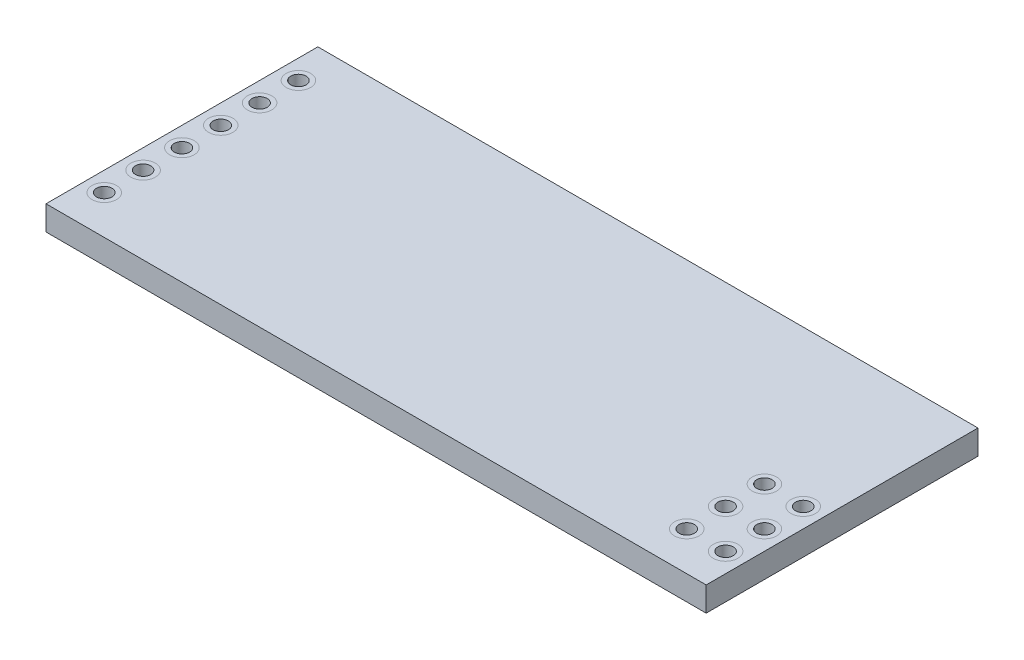
ISO-10303-21;
HEADER;
FILE_DESCRIPTION(('STEP AP214'),'2;1');
FILE_NAME('part.step','',(''),(''),'','','');
FILE_SCHEMA(('AUTOMOTIVE_DESIGN { 1 0 10303 214 1 1 1 1 }'));
ENDSEC;
DATA;
#1=APPLICATION_CONTEXT('core data for automotive mechanical design processes');
#2=APPLICATION_PROTOCOL_DEFINITION('international standard','automotive_design',2000,#1);
#3=PRODUCT_CONTEXT('',#1,'mechanical');
#4=PRODUCT('Part','Part','',(#3));
#5=PRODUCT_RELATED_PRODUCT_CATEGORY('part','',(#4));
#6=PRODUCT_DEFINITION_FORMATION('','',#4);
#7=PRODUCT_DEFINITION_CONTEXT('part definition',#1,'design');
#8=PRODUCT_DEFINITION('design','',#6,#7);
#9=PRODUCT_DEFINITION_SHAPE('','',#8);
#10=(LENGTH_UNIT() NAMED_UNIT(*) SI_UNIT(.MILLI.,.METRE.));
#11=(NAMED_UNIT(*) PLANE_ANGLE_UNIT() SI_UNIT($,.RADIAN.));
#12=(NAMED_UNIT(*) SI_UNIT($,.STERADIAN.) SOLID_ANGLE_UNIT());
#13=UNCERTAINTY_MEASURE_WITH_UNIT(LENGTH_MEASURE(1.E-05),#10,'distance_accuracy_value','');
#14=(GEOMETRIC_REPRESENTATION_CONTEXT(3) GLOBAL_UNCERTAINTY_ASSIGNED_CONTEXT((#13)) GLOBAL_UNIT_ASSIGNED_CONTEXT((#10,
#11,#12)) REPRESENTATION_CONTEXT('',''));
#15=CARTESIAN_POINT('',(0.,0.,0.));
#16=DIRECTION('',(0.,0.,1.));
#17=DIRECTION('',(1.,0.,0.));
#18=AXIS2_PLACEMENT_3D('',#15,#16,#17);
#19=CARTESIAN_POINT('',(0.,1.6,0.));
#20=DIRECTION('',(0.,1.,0.));
#21=DIRECTION('',(0.,0.,1.));
#22=AXIS2_PLACEMENT_3D('',#19,#20,#21);
#23=PLANE('',#22);
#24=CARTESIAN_POINT('',(20.32,1.6,6.35000000000001));
#25=DIRECTION('',(0.,1.,0.));
#26=DIRECTION('',(0.,0.,1.));
#27=AXIS2_PLACEMENT_3D('',#24,#25,#26);
#28=CIRCLE('',#27,0.80000000000055);
#29=CARTESIAN_POINT('',(20.32,1.6,7.15000000000056));
#30=VERTEX_POINT('',#29);
#31=EDGE_CURVE('E147',#30,#30,#28,.F.);
#32=ORIENTED_EDGE('',*,*,#31,.T.);
#33=EDGE_LOOP('',(#32));
#34=FACE_BOUND('',#33,.T.);
#35=CARTESIAN_POINT('',(17.78,1.6,6.35000000000003));
#36=DIRECTION('',(0.,1.,0.));
#37=DIRECTION('',(0.,0.,1.));
#38=AXIS2_PLACEMENT_3D('',#35,#36,#37);
#39=CIRCLE('',#38,0.800000000000557);
#40=CARTESIAN_POINT('',(17.78,1.6,7.15000000000058));
#41=VERTEX_POINT('',#40);
#42=EDGE_CURVE('E144',#41,#41,#39,.F.);
#43=ORIENTED_EDGE('',*,*,#42,.T.);
#44=EDGE_LOOP('',(#43));
#45=FACE_BOUND('',#44,.T.);
#46=CARTESIAN_POINT('',(20.32,1.6,3.81000000000001));
#47=DIRECTION('',(0.,1.,0.));
#48=DIRECTION('',(0.,0.,1.));
#49=AXIS2_PLACEMENT_3D('',#46,#47,#48);
#50=CIRCLE('',#49,0.80000000000055);
#51=CARTESIAN_POINT('',(20.32,1.6,4.61000000000056));
#52=VERTEX_POINT('',#51);
#53=EDGE_CURVE('E141',#52,#52,#50,.F.);
#54=ORIENTED_EDGE('',*,*,#53,.T.);
#55=EDGE_LOOP('',(#54));
#56=FACE_BOUND('',#55,.T.);
#57=CARTESIAN_POINT('',(17.78,1.6,3.81000000000003));
#58=DIRECTION('',(0.,1.,0.));
#59=DIRECTION('',(0.,0.,1.));
#60=AXIS2_PLACEMENT_3D('',#57,#58,#59);
#61=CIRCLE('',#60,0.800000000000557);
#62=CARTESIAN_POINT('',(17.78,1.6,4.61000000000058));
#63=VERTEX_POINT('',#62);
#64=EDGE_CURVE('E138',#63,#63,#61,.F.);
#65=ORIENTED_EDGE('',*,*,#64,.T.);
#66=EDGE_LOOP('',(#65));
#67=FACE_BOUND('',#66,.T.);
#68=CARTESIAN_POINT('',(20.32,1.6,1.27000000000001));
#69=DIRECTION('',(0.,1.,0.));
#70=DIRECTION('',(0.,0.,1.));
#71=AXIS2_PLACEMENT_3D('',#68,#69,#70);
#72=CIRCLE('',#71,0.80000000000055);
#73=CARTESIAN_POINT('',(20.32,1.6,2.07000000000056));
#74=VERTEX_POINT('',#73);
#75=EDGE_CURVE('E135',#74,#74,#72,.F.);
#76=ORIENTED_EDGE('',*,*,#75,.T.);
#77=EDGE_LOOP('',(#76));
#78=FACE_BOUND('',#77,.T.);
#79=CARTESIAN_POINT('',(17.78,1.6,1.27000000000003));
#80=DIRECTION('',(0.,1.,0.));
#81=DIRECTION('',(0.,0.,1.));
#82=AXIS2_PLACEMENT_3D('',#79,#80,#81);
#83=CIRCLE('',#82,0.800000000000557);
#84=CARTESIAN_POINT('',(17.78,1.6,2.07000000000058));
#85=VERTEX_POINT('',#84);
#86=EDGE_CURVE('E132',#85,#85,#83,.F.);
#87=ORIENTED_EDGE('',*,*,#86,.T.);
#88=EDGE_LOOP('',(#87));
#89=FACE_BOUND('',#88,.T.);
#90=CARTESIAN_POINT('',(-20.32,1.6,6.35000000000001));
#91=DIRECTION('',(0.,1.,0.));
#92=DIRECTION('',(0.,0.,1.));
#93=AXIS2_PLACEMENT_3D('',#90,#91,#92);
#94=CIRCLE('',#93,0.800000000000551);
#95=CARTESIAN_POINT('',(-20.32,1.6,7.15000000000056));
#96=VERTEX_POINT('',#95);
#97=EDGE_CURVE('E129',#96,#96,#94,.F.);
#98=ORIENTED_EDGE('',*,*,#97,.T.);
#99=EDGE_LOOP('',(#98));
#100=FACE_BOUND('',#99,.T.);
#101=CARTESIAN_POINT('',(-20.32,1.6,3.81000000000001));
#102=DIRECTION('',(0.,1.,0.));
#103=DIRECTION('',(0.,0.,1.));
#104=AXIS2_PLACEMENT_3D('',#101,#102,#103);
#105=CIRCLE('',#104,0.80000000000055);
#106=CARTESIAN_POINT('',(-20.32,1.6,4.61000000000056));
#107=VERTEX_POINT('',#106);
#108=EDGE_CURVE('E126',#107,#107,#105,.F.);
#109=ORIENTED_EDGE('',*,*,#108,.T.);
#110=EDGE_LOOP('',(#109));
#111=FACE_BOUND('',#110,.T.);
#112=CARTESIAN_POINT('',(-20.32,1.6,1.27000000000001));
#113=DIRECTION('',(0.,1.,0.));
#114=DIRECTION('',(0.,0.,1.));
#115=AXIS2_PLACEMENT_3D('',#112,#113,#114);
#116=CIRCLE('',#115,0.80000000000055);
#117=CARTESIAN_POINT('',(-20.32,1.6,2.07000000000056));
#118=VERTEX_POINT('',#117);
#119=EDGE_CURVE('E123',#118,#118,#116,.F.);
#120=ORIENTED_EDGE('',*,*,#119,.T.);
#121=EDGE_LOOP('',(#120));
#122=FACE_BOUND('',#121,.T.);
#123=CARTESIAN_POINT('',(-20.32,1.6,-1.26999999999999));
#124=DIRECTION('',(0.,1.,0.));
#125=DIRECTION('',(0.,0.,1.));
#126=AXIS2_PLACEMENT_3D('',#123,#124,#125);
#127=CIRCLE('',#126,0.80000000000055);
#128=CARTESIAN_POINT('',(-20.32,1.6,-0.46999999999944));
#129=VERTEX_POINT('',#128);
#130=EDGE_CURVE('E120',#129,#129,#127,.F.);
#131=ORIENTED_EDGE('',*,*,#130,.T.);
#132=EDGE_LOOP('',(#131));
#133=FACE_BOUND('',#132,.T.);
#134=CARTESIAN_POINT('',(-20.32,1.6,-3.80999999999999));
#135=DIRECTION('',(0.,1.,0.));
#136=DIRECTION('',(0.,0.,1.));
#137=AXIS2_PLACEMENT_3D('',#134,#135,#136);
#138=CIRCLE('',#137,0.800000000000558);
#139=CARTESIAN_POINT('',(-20.32,1.6,-3.00999999999943));
#140=VERTEX_POINT('',#139);
#141=EDGE_CURVE('E117',#140,#140,#138,.F.);
#142=ORIENTED_EDGE('',*,*,#141,.T.);
#143=EDGE_LOOP('',(#142));
#144=FACE_BOUND('',#143,.T.);
#145=CARTESIAN_POINT('',(-20.32,1.6,-6.34999999999999));
#146=DIRECTION('',(0.,1.,0.));
#147=DIRECTION('',(0.,0.,1.));
#148=AXIS2_PLACEMENT_3D('',#145,#146,#147);
#149=CIRCLE('',#148,0.800000000000558);
#150=CARTESIAN_POINT('',(-20.32,1.6,-5.54999999999943));
#151=VERTEX_POINT('',#150);
#152=EDGE_CURVE('E114',#151,#151,#149,.F.);
#153=ORIENTED_EDGE('',*,*,#152,.T.);
#154=EDGE_LOOP('',(#153));
#155=FACE_BOUND('',#154,.T.);
#156=DIRECTION('',(0.,0.,-1.));
#157=VECTOR('',#156,1.);
#158=CARTESIAN_POINT('',(21.59,1.6,-8.89));
#159=LINE('',#158,#157);
#160=CARTESIAN_POINT('',(21.59,1.6,8.89));
#161=VERTEX_POINT('',#160);
#162=CARTESIAN_POINT('',(21.59,1.6,-8.89));
#163=VERTEX_POINT('',#162);
#164=EDGE_CURVE('E87',#161,#163,#159,.T.);
#165=ORIENTED_EDGE('',*,*,#164,.T.);
#166=DIRECTION('',(-1.,0.,0.));
#167=VECTOR('',#166,1.);
#168=CARTESIAN_POINT('',(-21.59,1.6,-8.89));
#169=LINE('',#168,#167);
#170=CARTESIAN_POINT('',(-21.59,1.6,-8.89));
#171=VERTEX_POINT('',#170);
#172=EDGE_CURVE('E83',#163,#171,#169,.T.);
#173=ORIENTED_EDGE('',*,*,#172,.T.);
#174=DIRECTION('',(0.,0.,1.));
#175=VECTOR('',#174,1.);
#176=CARTESIAN_POINT('',(-21.59,1.6,-8.89));
#177=LINE('',#176,#175);
#178=CARTESIAN_POINT('',(-21.59,1.6,8.89));
#179=VERTEX_POINT('',#178);
#180=EDGE_CURVE('E85',#171,#179,#177,.T.);
#181=ORIENTED_EDGE('',*,*,#180,.T.);
#182=DIRECTION('',(1.,0.,0.));
#183=VECTOR('',#182,1.);
#184=CARTESIAN_POINT('',(-21.59,1.6,8.89));
#185=LINE('',#184,#183);
#186=EDGE_CURVE('E52',#179,#161,#185,.T.);
#187=ORIENTED_EDGE('',*,*,#186,.T.);
#188=EDGE_LOOP('',(#165,#173,#181,#187));
#189=FACE_BOUND('',#188,.T.);
#190=ADVANCED_FACE('F35',(#34,#45,#56,#67,#78,#89,#100,#111,#122,#133,#144,#155,#189),#23,.T.);
#191=CARTESIAN_POINT('',(0.,0.,0.));
#192=DIRECTION('',(0.,1.,0.));
#193=DIRECTION('',(0.,0.,1.));
#194=AXIS2_PLACEMENT_3D('',#191,#192,#193);
#195=PLANE('',#194);
#196=CARTESIAN_POINT('',(20.32,0.,1.27000000000001));
#197=DIRECTION('',(0.,1.,0.));
#198=DIRECTION('',(0.,0.,1.));
#199=AXIS2_PLACEMENT_3D('',#196,#197,#198);
#200=CIRCLE('',#199,0.800000000000592);
#201=CARTESIAN_POINT('',(20.32,0.,2.0700000000006));
#202=VERTEX_POINT('',#201);
#203=EDGE_CURVE('E216',#202,#202,#200,.T.);
#204=ORIENTED_EDGE('',*,*,#203,.T.);
#205=EDGE_LOOP('',(#204));
#206=FACE_BOUND('',#205,.T.);
#207=CARTESIAN_POINT('',(17.78,0.,1.27000000000003));
#208=DIRECTION('',(0.,1.,0.));
#209=DIRECTION('',(0.,0.,1.));
#210=AXIS2_PLACEMENT_3D('',#207,#208,#209);
#211=CIRCLE('',#210,0.800000000000599);
#212=CARTESIAN_POINT('',(17.78,0.,2.07000000000063));
#213=VERTEX_POINT('',#212);
#214=EDGE_CURVE('E213',#213,#213,#211,.T.);
#215=ORIENTED_EDGE('',*,*,#214,.T.);
#216=EDGE_LOOP('',(#215));
#217=FACE_BOUND('',#216,.T.);
#218=CARTESIAN_POINT('',(17.78,0.,3.81000000000003));
#219=DIRECTION('',(0.,1.,0.));
#220=DIRECTION('',(0.,0.,1.));
#221=AXIS2_PLACEMENT_3D('',#218,#219,#220);
#222=CIRCLE('',#221,0.800000000000599);
#223=CARTESIAN_POINT('',(17.78,0.,4.61000000000063));
#224=VERTEX_POINT('',#223);
#225=EDGE_CURVE('E210',#224,#224,#222,.T.);
#226=ORIENTED_EDGE('',*,*,#225,.T.);
#227=EDGE_LOOP('',(#226));
#228=FACE_BOUND('',#227,.T.);
#229=CARTESIAN_POINT('',(20.32,0.,3.81000000000001));
#230=DIRECTION('',(0.,1.,0.));
#231=DIRECTION('',(0.,0.,1.));
#232=AXIS2_PLACEMENT_3D('',#229,#230,#231);
#233=CIRCLE('',#232,0.800000000000591);
#234=CARTESIAN_POINT('',(20.32,0.,4.6100000000006));
#235=VERTEX_POINT('',#234);
#236=EDGE_CURVE('E207',#235,#235,#233,.T.);
#237=ORIENTED_EDGE('',*,*,#236,.T.);
#238=EDGE_LOOP('',(#237));
#239=FACE_BOUND('',#238,.T.);
#240=CARTESIAN_POINT('',(20.32,0.,6.35000000000001));
#241=DIRECTION('',(0.,1.,0.));
#242=DIRECTION('',(0.,0.,1.));
#243=AXIS2_PLACEMENT_3D('',#240,#241,#242);
#244=CIRCLE('',#243,0.800000000000592);
#245=CARTESIAN_POINT('',(20.32,0.,7.1500000000006));
#246=VERTEX_POINT('',#245);
#247=EDGE_CURVE('E204',#246,#246,#244,.T.);
#248=ORIENTED_EDGE('',*,*,#247,.T.);
#249=EDGE_LOOP('',(#248));
#250=FACE_BOUND('',#249,.T.);
#251=CARTESIAN_POINT('',(17.78,0.,6.35000000000003));
#252=DIRECTION('',(0.,1.,0.));
#253=DIRECTION('',(0.,0.,1.));
#254=AXIS2_PLACEMENT_3D('',#251,#252,#253);
#255=CIRCLE('',#254,0.800000000000599);
#256=CARTESIAN_POINT('',(17.78,0.,7.15000000000063));
#257=VERTEX_POINT('',#256);
#258=EDGE_CURVE('E201',#257,#257,#255,.T.);
#259=ORIENTED_EDGE('',*,*,#258,.T.);
#260=EDGE_LOOP('',(#259));
#261=FACE_BOUND('',#260,.T.);
#262=CARTESIAN_POINT('',(-20.32,0.,-6.34999999999999));
#263=DIRECTION('',(0.,1.,0.));
#264=DIRECTION('',(0.,0.,1.));
#265=AXIS2_PLACEMENT_3D('',#262,#263,#264);
#266=CIRCLE('',#265,0.8000000000006);
#267=CARTESIAN_POINT('',(-20.32,0.,-5.54999999999939));
#268=VERTEX_POINT('',#267);
#269=EDGE_CURVE('E198',#268,#268,#266,.T.);
#270=ORIENTED_EDGE('',*,*,#269,.T.);
#271=EDGE_LOOP('',(#270));
#272=FACE_BOUND('',#271,.T.);
#273=CARTESIAN_POINT('',(-20.32,0.,-3.80999999999999));
#274=DIRECTION('',(0.,1.,0.));
#275=DIRECTION('',(0.,0.,1.));
#276=AXIS2_PLACEMENT_3D('',#273,#274,#275);
#277=CIRCLE('',#276,0.800000000000599);
#278=CARTESIAN_POINT('',(-20.32,0.,-3.00999999999939));
#279=VERTEX_POINT('',#278);
#280=EDGE_CURVE('E195',#279,#279,#277,.T.);
#281=ORIENTED_EDGE('',*,*,#280,.T.);
#282=EDGE_LOOP('',(#281));
#283=FACE_BOUND('',#282,.T.);
#284=CARTESIAN_POINT('',(-20.32,0.,-1.26999999999999));
#285=DIRECTION('',(0.,1.,0.));
#286=DIRECTION('',(0.,0.,1.));
#287=AXIS2_PLACEMENT_3D('',#284,#285,#286);
#288=CIRCLE('',#287,0.800000000000592);
#289=CARTESIAN_POINT('',(-20.32,0.,-0.469999999999398));
#290=VERTEX_POINT('',#289);
#291=EDGE_CURVE('E192',#290,#290,#288,.T.);
#292=ORIENTED_EDGE('',*,*,#291,.T.);
#293=EDGE_LOOP('',(#292));
#294=FACE_BOUND('',#293,.T.);
#295=CARTESIAN_POINT('',(-20.32,0.,1.27000000000001));
#296=DIRECTION('',(0.,1.,0.));
#297=DIRECTION('',(0.,0.,1.));
#298=AXIS2_PLACEMENT_3D('',#295,#296,#297);
#299=CIRCLE('',#298,0.800000000000592);
#300=CARTESIAN_POINT('',(-20.32,0.,2.0700000000006));
#301=VERTEX_POINT('',#300);
#302=EDGE_CURVE('E189',#301,#301,#299,.T.);
#303=ORIENTED_EDGE('',*,*,#302,.T.);
#304=EDGE_LOOP('',(#303));
#305=FACE_BOUND('',#304,.T.);
#306=CARTESIAN_POINT('',(-20.32,0.,3.81000000000001));
#307=DIRECTION('',(0.,1.,0.));
#308=DIRECTION('',(0.,0.,1.));
#309=AXIS2_PLACEMENT_3D('',#306,#307,#308);
#310=CIRCLE('',#309,0.800000000000592);
#311=CARTESIAN_POINT('',(-20.32,0.,4.6100000000006));
#312=VERTEX_POINT('',#311);
#313=EDGE_CURVE('E186',#312,#312,#310,.T.);
#314=ORIENTED_EDGE('',*,*,#313,.T.);
#315=EDGE_LOOP('',(#314));
#316=FACE_BOUND('',#315,.T.);
#317=CARTESIAN_POINT('',(-20.32,0.,6.35000000000001));
#318=DIRECTION('',(0.,1.,0.));
#319=DIRECTION('',(0.,0.,1.));
#320=AXIS2_PLACEMENT_3D('',#317,#318,#319);
#321=CIRCLE('',#320,0.800000000000593);
#322=CARTESIAN_POINT('',(-20.32,0.,7.1500000000006));
#323=VERTEX_POINT('',#322);
#324=EDGE_CURVE('E183',#323,#323,#321,.T.);
#325=ORIENTED_EDGE('',*,*,#324,.T.);
#326=EDGE_LOOP('',(#325));
#327=FACE_BOUND('',#326,.T.);
#328=DIRECTION('',(0.,0.,-1.));
#329=VECTOR('',#328,1.);
#330=CARTESIAN_POINT('',(21.59,0.,-8.89));
#331=LINE('',#330,#329);
#332=CARTESIAN_POINT('',(21.59,0.,8.89));
#333=VERTEX_POINT('',#332);
#334=CARTESIAN_POINT('',(21.59,0.,-8.89));
#335=VERTEX_POINT('',#334);
#336=EDGE_CURVE('E102',#333,#335,#331,.T.);
#337=ORIENTED_EDGE('',*,*,#336,.F.);
#338=DIRECTION('',(1.,0.,0.));
#339=VECTOR('',#338,1.);
#340=CARTESIAN_POINT('',(-21.59,0.,8.89));
#341=LINE('',#340,#339);
#342=CARTESIAN_POINT('',(-21.59,0.,8.89));
#343=VERTEX_POINT('',#342);
#344=EDGE_CURVE('E75',#343,#333,#341,.T.);
#345=ORIENTED_EDGE('',*,*,#344,.F.);
#346=DIRECTION('',(0.,0.,1.));
#347=VECTOR('',#346,1.);
#348=CARTESIAN_POINT('',(-21.59,0.,-8.89));
#349=LINE('',#348,#347);
#350=CARTESIAN_POINT('',(-21.59,0.,-8.89));
#351=VERTEX_POINT('',#350);
#352=EDGE_CURVE('E69',#351,#343,#349,.T.);
#353=ORIENTED_EDGE('',*,*,#352,.F.);
#354=DIRECTION('',(-1.,0.,0.));
#355=VECTOR('',#354,1.);
#356=CARTESIAN_POINT('',(-21.59,0.,-8.89));
#357=LINE('',#356,#355);
#358=EDGE_CURVE('E92',#335,#351,#357,.T.);
#359=ORIENTED_EDGE('',*,*,#358,.F.);
#360=EDGE_LOOP('',(#337,#345,#353,#359));
#361=FACE_BOUND('',#360,.T.);
#362=ADVANCED_FACE('F260',(#206,#217,#228,#239,#250,#261,#272,#283,#294,#305,#316,#327,#361),
#195,.F.);
#363=CARTESIAN_POINT('',(21.59,1.6,-8.89));
#364=DIRECTION('',(-1.,0.,0.));
#365=DIRECTION('',(0.,0.,1.));
#366=AXIS2_PLACEMENT_3D('',#363,#364,#365);
#367=PLANE('',#366);
#368=ORIENTED_EDGE('',*,*,#336,.T.);
#369=DIRECTION('',(0.,-1.,0.));
#370=VECTOR('',#369,1.);
#371=CARTESIAN_POINT('',(21.59,1.6,-8.89));
#372=LINE('',#371,#370);
#373=EDGE_CURVE('E93',#163,#335,#372,.T.);
#374=ORIENTED_EDGE('',*,*,#373,.F.);
#375=ORIENTED_EDGE('',*,*,#164,.F.);
#376=DIRECTION('',(0.,-1.,0.));
#377=VECTOR('',#376,1.);
#378=CARTESIAN_POINT('',(21.59,1.6,8.89));
#379=LINE('',#378,#377);
#380=EDGE_CURVE('E98',#161,#333,#379,.T.);
#381=ORIENTED_EDGE('',*,*,#380,.T.);
#382=EDGE_LOOP('',(#368,#374,#375,#381));
#383=FACE_BOUND('',#382,.T.);
#384=ADVANCED_FACE('F263',(#383),#367,.F.);
#385=CARTESIAN_POINT('',(-21.59,1.6,-8.89));
#386=DIRECTION('',(0.,0.,1.));
#387=DIRECTION('',(1.,0.,0.));
#388=AXIS2_PLACEMENT_3D('',#385,#386,#387);
#389=PLANE('',#388);
#390=ORIENTED_EDGE('',*,*,#358,.T.);
#391=DIRECTION('',(0.,-1.,0.));
#392=VECTOR('',#391,1.);
#393=CARTESIAN_POINT('',(-21.59,1.6,-8.89));
#394=LINE('',#393,#392);
#395=EDGE_CURVE('E90',#171,#351,#394,.T.);
#396=ORIENTED_EDGE('',*,*,#395,.F.);
#397=ORIENTED_EDGE('',*,*,#172,.F.);
#398=ORIENTED_EDGE('',*,*,#373,.T.);
#399=EDGE_LOOP('',(#390,#396,#397,#398));
#400=FACE_BOUND('',#399,.T.);
#401=ADVANCED_FACE('F91',(#400),#389,.F.);
#402=CARTESIAN_POINT('',(-21.59,1.6,-8.89));
#403=DIRECTION('',(1.,0.,0.));
#404=DIRECTION('',(0.,0.,-1.));
#405=AXIS2_PLACEMENT_3D('',#402,#403,#404);
#406=PLANE('',#405);
#407=ORIENTED_EDGE('',*,*,#352,.T.);
#408=DIRECTION('',(0.,-1.,0.));
#409=VECTOR('',#408,1.);
#410=CARTESIAN_POINT('',(-21.59,1.6,8.89));
#411=LINE('',#410,#409);
#412=EDGE_CURVE('E94',#179,#343,#411,.T.);
#413=ORIENTED_EDGE('',*,*,#412,.F.);
#414=ORIENTED_EDGE('',*,*,#180,.F.);
#415=ORIENTED_EDGE('',*,*,#395,.T.);
#416=EDGE_LOOP('',(#407,#413,#414,#415));
#417=FACE_BOUND('',#416,.T.);
#418=ADVANCED_FACE('F96',(#417),#406,.F.);
#419=CARTESIAN_POINT('',(-21.59,1.6,8.89));
#420=DIRECTION('',(0.,0.,-1.));
#421=DIRECTION('',(-1.,0.,0.));
#422=AXIS2_PLACEMENT_3D('',#419,#420,#421);
#423=PLANE('',#422);
#424=ORIENTED_EDGE('',*,*,#344,.T.);
#425=ORIENTED_EDGE('',*,*,#380,.F.);
#426=ORIENTED_EDGE('',*,*,#186,.F.);
#427=ORIENTED_EDGE('',*,*,#412,.T.);
#428=EDGE_LOOP('',(#424,#425,#426,#427));
#429=FACE_BOUND('',#428,.T.);
#430=ADVANCED_FACE('F270',(#429),#423,.F.);
#431=CARTESIAN_POINT('',(20.32,1.6,6.35000000000001));
#432=DIRECTION('',(0.,-1.,0.));
#433=DIRECTION('',(0.,0.,-1.));
#434=AXIS2_PLACEMENT_3D('',#431,#432,#433);
#435=CYLINDRICAL_SURFACE('',#434,0.499999999999999);
#436=CARTESIAN_POINT('',(20.32,0.000523599307256702,6.35000000000001));
#437=DIRECTION('',(0.,1.,0.));
#438=DIRECTION('',(0.,0.,1.));
#439=AXIS2_PLACEMENT_3D('',#436,#437,#438);
#440=CIRCLE('',#439,0.499999999999999);
#441=CARTESIAN_POINT('',(20.32,0.000523599307256702,6.85000000000001));
#442=VERTEX_POINT('',#441);
#443=EDGE_CURVE('E231',#442,#442,#440,.F.);
#444=ORIENTED_EDGE('',*,*,#443,.T.);
#445=EDGE_LOOP('',(#444));
#446=FACE_BOUND('',#445,.T.);
#447=CARTESIAN_POINT('',(20.32,1.59947640069274,6.35000000000001));
#448=DIRECTION('',(0.,1.,0.));
#449=DIRECTION('',(0.,0.,1.));
#450=AXIS2_PLACEMENT_3D('',#447,#448,#449);
#451=CIRCLE('',#450,0.499999999999999);
#452=CARTESIAN_POINT('',(20.32,1.59947640069274,6.85000000000001));
#453=VERTEX_POINT('',#452);
#454=EDGE_CURVE('E111',#453,#453,#451,.T.);
#455=ORIENTED_EDGE('',*,*,#454,.T.);
#456=EDGE_LOOP('',(#455));
#457=FACE_BOUND('',#456,.T.);
#458=ADVANCED_FACE('F272',(#446,#457),#435,.F.);
#459=CARTESIAN_POINT('',(-20.32,1.6,-3.80999999999999));
#460=DIRECTION('',(0.,-1.,0.));
#461=DIRECTION('',(0.,0.,-1.));
#462=AXIS2_PLACEMENT_3D('',#459,#460,#461);
#463=CYLINDRICAL_SURFACE('',#462,0.499999999999999);
#464=CARTESIAN_POINT('',(-20.32,0.000523599307256702,-3.80999999999999));
#465=DIRECTION('',(0.,1.,0.));
#466=DIRECTION('',(0.,0.,1.));
#467=AXIS2_PLACEMENT_3D('',#464,#465,#466);
#468=CIRCLE('',#467,0.499999999999999);
#469=CARTESIAN_POINT('',(-20.32,0.000523599307256702,-3.30999999999999));
#470=VERTEX_POINT('',#469);
#471=EDGE_CURVE('E240',#470,#470,#468,.F.);
#472=ORIENTED_EDGE('',*,*,#471,.T.);
#473=EDGE_LOOP('',(#472));
#474=FACE_BOUND('',#473,.T.);
#475=CARTESIAN_POINT('',(-20.32,1.59947640069274,-3.80999999999999));
#476=DIRECTION('',(0.,1.,0.));
#477=DIRECTION('',(0.,0.,1.));
#478=AXIS2_PLACEMENT_3D('',#475,#476,#477);
#479=CIRCLE('',#478,0.499999999999999);
#480=CARTESIAN_POINT('',(-20.32,1.59947640069274,-3.30999999999999));
#481=VERTEX_POINT('',#480);
#482=EDGE_CURVE('E177',#481,#481,#479,.T.);
#483=ORIENTED_EDGE('',*,*,#482,.T.);
#484=EDGE_LOOP('',(#483));
#485=FACE_BOUND('',#484,.T.);
#486=ADVANCED_FACE('F278',(#474,#485),#463,.F.);
#487=CARTESIAN_POINT('',(-20.32,1.6,-1.26999999999999));
#488=DIRECTION('',(0.,-1.,0.));
#489=DIRECTION('',(0.,0.,-1.));
#490=AXIS2_PLACEMENT_3D('',#487,#488,#489);
#491=CYLINDRICAL_SURFACE('',#490,0.499999999999999);
#492=CARTESIAN_POINT('',(-20.32,0.000523599307256702,-1.26999999999999));
#493=DIRECTION('',(0.,1.,0.));
#494=DIRECTION('',(0.,0.,1.));
#495=AXIS2_PLACEMENT_3D('',#492,#493,#494);
#496=CIRCLE('',#495,0.499999999999999);
#497=CARTESIAN_POINT('',(-20.32,0.000523599307256702,-0.769999999999991));
#498=VERTEX_POINT('',#497);
#499=EDGE_CURVE('E243',#498,#498,#496,.F.);
#500=ORIENTED_EDGE('',*,*,#499,.T.);
#501=EDGE_LOOP('',(#500));
#502=FACE_BOUND('',#501,.T.);
#503=CARTESIAN_POINT('',(-20.32,1.59947640069274,-1.26999999999999));
#504=DIRECTION('',(0.,1.,0.));
#505=DIRECTION('',(0.,0.,1.));
#506=AXIS2_PLACEMENT_3D('',#503,#504,#505);
#507=CIRCLE('',#506,0.499999999999999);
#508=CARTESIAN_POINT('',(-20.32,1.59947640069274,-0.769999999999991));
#509=VERTEX_POINT('',#508);
#510=EDGE_CURVE('E174',#509,#509,#507,.T.);
#511=ORIENTED_EDGE('',*,*,#510,.T.);
#512=EDGE_LOOP('',(#511));
#513=FACE_BOUND('',#512,.T.);
#514=ADVANCED_FACE('F291',(#502,#513),#491,.F.);
#515=CARTESIAN_POINT('',(-20.32,1.6,1.27000000000001));
#516=DIRECTION('',(0.,-1.,0.));
#517=DIRECTION('',(0.,0.,-1.));
#518=AXIS2_PLACEMENT_3D('',#515,#516,#517);
#519=CYLINDRICAL_SURFACE('',#518,0.499999999999999);
#520=CARTESIAN_POINT('',(-20.32,0.000523599307256702,1.27000000000001));
#521=DIRECTION('',(0.,1.,0.));
#522=DIRECTION('',(0.,0.,1.));
#523=AXIS2_PLACEMENT_3D('',#520,#521,#522);
#524=CIRCLE('',#523,0.499999999999999);
#525=CARTESIAN_POINT('',(-20.32,0.000523599307256702,1.77000000000001));
#526=VERTEX_POINT('',#525);
#527=EDGE_CURVE('E246',#526,#526,#524,.F.);
#528=ORIENTED_EDGE('',*,*,#527,.T.);
#529=EDGE_LOOP('',(#528));
#530=FACE_BOUND('',#529,.T.);
#531=CARTESIAN_POINT('',(-20.32,1.59947640069274,1.27000000000001));
#532=DIRECTION('',(0.,1.,0.));
#533=DIRECTION('',(0.,0.,1.));
#534=AXIS2_PLACEMENT_3D('',#531,#532,#533);
#535=CIRCLE('',#534,0.499999999999999);
#536=CARTESIAN_POINT('',(-20.32,1.59947640069274,1.77000000000001));
#537=VERTEX_POINT('',#536);
#538=EDGE_CURVE('E171',#537,#537,#535,.T.);
#539=ORIENTED_EDGE('',*,*,#538,.T.);
#540=EDGE_LOOP('',(#539));
#541=FACE_BOUND('',#540,.T.);
#542=ADVANCED_FACE('F295',(#530,#541),#519,.F.);
#543=CARTESIAN_POINT('',(-20.32,1.6,3.81000000000001));
#544=DIRECTION('',(0.,-1.,0.));
#545=DIRECTION('',(0.,0.,-1.));
#546=AXIS2_PLACEMENT_3D('',#543,#544,#545);
#547=CYLINDRICAL_SURFACE('',#546,0.499999999999999);
#548=CARTESIAN_POINT('',(-20.32,0.000523599307256702,3.81000000000001));
#549=DIRECTION('',(0.,1.,0.));
#550=DIRECTION('',(0.,0.,1.));
#551=AXIS2_PLACEMENT_3D('',#548,#549,#550);
#552=CIRCLE('',#551,0.499999999999999);
#553=CARTESIAN_POINT('',(-20.32,0.000523599307256702,4.31000000000001));
#554=VERTEX_POINT('',#553);
#555=EDGE_CURVE('E44',#554,#554,#552,.F.);
#556=ORIENTED_EDGE('',*,*,#555,.T.);
#557=EDGE_LOOP('',(#556));
#558=FACE_BOUND('',#557,.T.);
#559=CARTESIAN_POINT('',(-20.32,1.59947640069274,3.81000000000001));
#560=DIRECTION('',(0.,1.,0.));
#561=DIRECTION('',(0.,0.,1.));
#562=AXIS2_PLACEMENT_3D('',#559,#560,#561);
#563=CIRCLE('',#562,0.499999999999999);
#564=CARTESIAN_POINT('',(-20.32,1.59947640069274,4.31000000000001));
#565=VERTEX_POINT('',#564);
#566=EDGE_CURVE('E168',#565,#565,#563,.T.);
#567=ORIENTED_EDGE('',*,*,#566,.T.);
#568=EDGE_LOOP('',(#567));
#569=FACE_BOUND('',#568,.T.);
#570=ADVANCED_FACE('F251',(#558,#569),#547,.F.);
#571=CARTESIAN_POINT('',(-20.32,1.6,6.35000000000001));
#572=DIRECTION('',(0.,-1.,0.));
#573=DIRECTION('',(0.,0.,-1.));
#574=AXIS2_PLACEMENT_3D('',#571,#572,#573);
#575=CYLINDRICAL_SURFACE('',#574,0.499999999999999);
#576=CARTESIAN_POINT('',(-20.32,0.000523599307256702,6.35000000000001));
#577=DIRECTION('',(0.,1.,0.));
#578=DIRECTION('',(0.,0.,1.));
#579=AXIS2_PLACEMENT_3D('',#576,#577,#578);
#580=CIRCLE('',#579,0.499999999999999);
#581=CARTESIAN_POINT('',(-20.32,0.000523599307256702,6.85000000000001));
#582=VERTEX_POINT('',#581);
#583=EDGE_CURVE('E11',#582,#582,#580,.F.);
#584=ORIENTED_EDGE('',*,*,#583,.T.);
#585=EDGE_LOOP('',(#584));
#586=FACE_BOUND('',#585,.T.);
#587=CARTESIAN_POINT('',(-20.32,1.59947640069274,6.35000000000001));
#588=DIRECTION('',(0.,1.,0.));
#589=DIRECTION('',(0.,0.,1.));
#590=AXIS2_PLACEMENT_3D('',#587,#588,#589);
#591=CIRCLE('',#590,0.499999999999999);
#592=CARTESIAN_POINT('',(-20.32,1.59947640069274,6.85000000000001));
#593=VERTEX_POINT('',#592);
#594=EDGE_CURVE('E165',#593,#593,#591,.T.);
#595=ORIENTED_EDGE('',*,*,#594,.T.);
#596=EDGE_LOOP('',(#595));
#597=FACE_BOUND('',#596,.T.);
#598=ADVANCED_FACE('F302',(#586,#597),#575,.F.);
#599=CARTESIAN_POINT('',(-20.32,1.6,-6.34999999999999));
#600=DIRECTION('',(0.,-1.,0.));
#601=DIRECTION('',(0.,0.,-1.));
#602=AXIS2_PLACEMENT_3D('',#599,#600,#601);
#603=CYLINDRICAL_SURFACE('',#602,0.499999999999999);
#604=CARTESIAN_POINT('',(-20.32,0.000523599307256702,-6.34999999999999));
#605=DIRECTION('',(0.,1.,0.));
#606=DIRECTION('',(0.,0.,1.));
#607=AXIS2_PLACEMENT_3D('',#604,#605,#606);
#608=CIRCLE('',#607,0.499999999999999);
#609=CARTESIAN_POINT('',(-20.32,0.000523599307256702,-5.84999999999999));
#610=VERTEX_POINT('',#609);
#611=EDGE_CURVE('E237',#610,#610,#608,.F.);
#612=ORIENTED_EDGE('',*,*,#611,.T.);
#613=EDGE_LOOP('',(#612));
#614=FACE_BOUND('',#613,.T.);
#615=CARTESIAN_POINT('',(-20.32,1.59947640069274,-6.34999999999999));
#616=DIRECTION('',(0.,1.,0.));
#617=DIRECTION('',(0.,0.,1.));
#618=AXIS2_PLACEMENT_3D('',#615,#616,#617);
#619=CIRCLE('',#618,0.499999999999999);
#620=CARTESIAN_POINT('',(-20.32,1.59947640069274,-5.84999999999999));
#621=VERTEX_POINT('',#620);
#622=EDGE_CURVE('E180',#621,#621,#619,.T.);
#623=ORIENTED_EDGE('',*,*,#622,.T.);
#624=EDGE_LOOP('',(#623));
#625=FACE_BOUND('',#624,.T.);
#626=ADVANCED_FACE('F305',(#614,#625),#603,.F.);
#627=CARTESIAN_POINT('',(17.78,1.6,6.35000000000003));
#628=DIRECTION('',(0.,-1.,0.));
#629=DIRECTION('',(0.,0.,-1.));
#630=AXIS2_PLACEMENT_3D('',#627,#628,#629);
#631=CYLINDRICAL_SURFACE('',#630,0.499999999999999);
#632=CARTESIAN_POINT('',(17.78,0.000523599307256702,6.35000000000003));
#633=DIRECTION('',(0.,1.,0.));
#634=DIRECTION('',(0.,0.,1.));
#635=AXIS2_PLACEMENT_3D('',#632,#633,#634);
#636=CIRCLE('',#635,0.499999999999999);
#637=CARTESIAN_POINT('',(17.78,0.000523599307256702,6.85000000000003));
#638=VERTEX_POINT('',#637);
#639=EDGE_CURVE('E234',#638,#638,#636,.F.);
#640=ORIENTED_EDGE('',*,*,#639,.T.);
#641=EDGE_LOOP('',(#640));
#642=FACE_BOUND('',#641,.T.);
#643=CARTESIAN_POINT('',(17.78,1.59947640069274,6.35000000000003));
#644=DIRECTION('',(0.,1.,0.));
#645=DIRECTION('',(0.,0.,1.));
#646=AXIS2_PLACEMENT_3D('',#643,#644,#645);
#647=CIRCLE('',#646,0.499999999999999);
#648=CARTESIAN_POINT('',(17.78,1.59947640069274,6.85000000000003));
#649=VERTEX_POINT('',#648);
#650=EDGE_CURVE('E150',#649,#649,#647,.T.);
#651=ORIENTED_EDGE('',*,*,#650,.T.);
#652=EDGE_LOOP('',(#651));
#653=FACE_BOUND('',#652,.T.);
#654=ADVANCED_FACE('F309',(#642,#653),#631,.F.);
#655=CARTESIAN_POINT('',(17.78,1.6,3.81000000000003));
#656=DIRECTION('',(0.,-1.,0.));
#657=DIRECTION('',(0.,0.,-1.));
#658=AXIS2_PLACEMENT_3D('',#655,#656,#657);
#659=CYLINDRICAL_SURFACE('',#658,0.499999999999999);
#660=CARTESIAN_POINT('',(17.78,0.000523599307256702,3.81000000000003));
#661=DIRECTION('',(0.,1.,0.));
#662=DIRECTION('',(0.,0.,1.));
#663=AXIS2_PLACEMENT_3D('',#660,#661,#662);
#664=CIRCLE('',#663,0.499999999999999);
#665=CARTESIAN_POINT('',(17.78,0.000523599307256702,4.31000000000003));
#666=VERTEX_POINT('',#665);
#667=EDGE_CURVE('E225',#666,#666,#664,.F.);
#668=ORIENTED_EDGE('',*,*,#667,.T.);
#669=EDGE_LOOP('',(#668));
#670=FACE_BOUND('',#669,.T.);
#671=CARTESIAN_POINT('',(17.78,1.59947640069274,3.81000000000003));
#672=DIRECTION('',(0.,1.,0.));
#673=DIRECTION('',(0.,0.,1.));
#674=AXIS2_PLACEMENT_3D('',#671,#672,#673);
#675=CIRCLE('',#674,0.499999999999999);
#676=CARTESIAN_POINT('',(17.78,1.59947640069274,4.31000000000003));
#677=VERTEX_POINT('',#676);
#678=EDGE_CURVE('E156',#677,#677,#675,.T.);
#679=ORIENTED_EDGE('',*,*,#678,.T.);
#680=EDGE_LOOP('',(#679));
#681=FACE_BOUND('',#680,.T.);
#682=ADVANCED_FACE('F313',(#670,#681),#659,.F.);
#683=CARTESIAN_POINT('',(17.78,1.6,1.27000000000003));
#684=DIRECTION('',(0.,-1.,0.));
#685=DIRECTION('',(0.,0.,-1.));
#686=AXIS2_PLACEMENT_3D('',#683,#684,#685);
#687=CYLINDRICAL_SURFACE('',#686,0.499999999999999);
#688=CARTESIAN_POINT('',(17.78,0.000523599307256702,1.27000000000003));
#689=DIRECTION('',(0.,1.,0.));
#690=DIRECTION('',(0.,0.,1.));
#691=AXIS2_PLACEMENT_3D('',#688,#689,#690);
#692=CIRCLE('',#691,0.499999999999999);
#693=CARTESIAN_POINT('',(17.78,0.000523599307256702,1.77000000000003));
#694=VERTEX_POINT('',#693);
#695=EDGE_CURVE('E222',#694,#694,#692,.F.);
#696=ORIENTED_EDGE('',*,*,#695,.T.);
#697=EDGE_LOOP('',(#696));
#698=FACE_BOUND('',#697,.T.);
#699=CARTESIAN_POINT('',(17.78,1.59947640069274,1.27000000000003));
#700=DIRECTION('',(0.,1.,0.));
#701=DIRECTION('',(0.,0.,1.));
#702=AXIS2_PLACEMENT_3D('',#699,#700,#701);
#703=CIRCLE('',#702,0.499999999999999);
#704=CARTESIAN_POINT('',(17.78,1.59947640069274,1.77000000000003));
#705=VERTEX_POINT('',#704);
#706=EDGE_CURVE('E162',#705,#705,#703,.T.);
#707=ORIENTED_EDGE('',*,*,#706,.T.);
#708=EDGE_LOOP('',(#707));
#709=FACE_BOUND('',#708,.T.);
#710=ADVANCED_FACE('F317',(#698,#709),#687,.F.);
#711=CARTESIAN_POINT('',(20.32,1.6,3.81000000000001));
#712=DIRECTION('',(0.,-1.,0.));
#713=DIRECTION('',(0.,0.,-1.));
#714=AXIS2_PLACEMENT_3D('',#711,#712,#713);
#715=CYLINDRICAL_SURFACE('',#714,0.499999999999999);
#716=CARTESIAN_POINT('',(20.32,0.000523599307256702,3.81000000000001));
#717=DIRECTION('',(0.,1.,0.));
#718=DIRECTION('',(0.,0.,1.));
#719=AXIS2_PLACEMENT_3D('',#716,#717,#718);
#720=CIRCLE('',#719,0.499999999999999);
#721=CARTESIAN_POINT('',(20.32,0.000523599307256702,4.31000000000001));
#722=VERTEX_POINT('',#721);
#723=EDGE_CURVE('E228',#722,#722,#720,.F.);
#724=ORIENTED_EDGE('',*,*,#723,.T.);
#725=EDGE_LOOP('',(#724));
#726=FACE_BOUND('',#725,.T.);
#727=CARTESIAN_POINT('',(20.32,1.59947640069274,3.81000000000001));
#728=DIRECTION('',(0.,1.,0.));
#729=DIRECTION('',(0.,0.,1.));
#730=AXIS2_PLACEMENT_3D('',#727,#728,#729);
#731=CIRCLE('',#730,0.499999999999999);
#732=CARTESIAN_POINT('',(20.32,1.59947640069274,4.31000000000001));
#733=VERTEX_POINT('',#732);
#734=EDGE_CURVE('E153',#733,#733,#731,.T.);
#735=ORIENTED_EDGE('',*,*,#734,.T.);
#736=EDGE_LOOP('',(#735));
#737=FACE_BOUND('',#736,.T.);
#738=ADVANCED_FACE('F321',(#726,#737),#715,.F.);
#739=CARTESIAN_POINT('',(20.32,1.6,1.27000000000001));
#740=DIRECTION('',(0.,-1.,0.));
#741=DIRECTION('',(0.,0.,-1.));
#742=AXIS2_PLACEMENT_3D('',#739,#740,#741);
#743=CYLINDRICAL_SURFACE('',#742,0.499999999999999);
#744=CARTESIAN_POINT('',(20.32,0.000523599307256702,1.27000000000001));
#745=DIRECTION('',(0.,1.,0.));
#746=DIRECTION('',(0.,0.,1.));
#747=AXIS2_PLACEMENT_3D('',#744,#745,#746);
#748=CIRCLE('',#747,0.499999999999999);
#749=CARTESIAN_POINT('',(20.32,0.000523599307256702,1.77000000000001));
#750=VERTEX_POINT('',#749);
#751=EDGE_CURVE('E219',#750,#750,#748,.F.);
#752=ORIENTED_EDGE('',*,*,#751,.T.);
#753=EDGE_LOOP('',(#752));
#754=FACE_BOUND('',#753,.T.);
#755=CARTESIAN_POINT('',(20.32,1.59947640069274,1.27000000000001));
#756=DIRECTION('',(0.,1.,0.));
#757=DIRECTION('',(0.,0.,1.));
#758=AXIS2_PLACEMENT_3D('',#755,#756,#757);
#759=CIRCLE('',#758,0.499999999999999);
#760=CARTESIAN_POINT('',(20.32,1.59947640069274,1.77000000000001));
#761=VERTEX_POINT('',#760);
#762=EDGE_CURVE('E159',#761,#761,#759,.T.);
#763=ORIENTED_EDGE('',*,*,#762,.T.);
#764=EDGE_LOOP('',(#763));
#765=FACE_BOUND('',#764,.T.);
#766=ADVANCED_FACE('F325',(#754,#765),#743,.F.);
#767=CARTESIAN_POINT('',(20.32,1.59947640069274,6.35000000000001));
#768=DIRECTION('',(0.,1.,0.));
#769=DIRECTION('',(0.,0.,1.));
#770=AXIS2_PLACEMENT_3D('',#767,#768,#769);
#771=CONICAL_SURFACE('',#770,0.499999999999999,1.56905099754291);
#772=ORIENTED_EDGE('',*,*,#31,.F.);
#773=EDGE_LOOP('',(#772));
#774=FACE_BOUND('',#773,.T.);
#775=ORIENTED_EDGE('',*,*,#454,.F.);
#776=EDGE_LOOP('',(#775));
#777=FACE_BOUND('',#776,.T.);
#778=ADVANCED_FACE('F328',(#774,#777),#771,.F.);
#779=CARTESIAN_POINT('',(17.78,1.59947640069274,6.35000000000003));
#780=DIRECTION('',(0.,1.,0.));
#781=DIRECTION('',(0.,0.,1.));
#782=AXIS2_PLACEMENT_3D('',#779,#780,#781);
#783=CONICAL_SURFACE('',#782,0.499999999999999,1.56905099754291);
#784=ORIENTED_EDGE('',*,*,#42,.F.);
#785=EDGE_LOOP('',(#784));
#786=FACE_BOUND('',#785,.T.);
#787=ORIENTED_EDGE('',*,*,#650,.F.);
#788=EDGE_LOOP('',(#787));
#789=FACE_BOUND('',#788,.T.);
#790=ADVANCED_FACE('F333',(#786,#789),#783,.F.);
#791=CARTESIAN_POINT('',(20.32,1.59947640069274,3.81000000000001));
#792=DIRECTION('',(0.,1.,0.));
#793=DIRECTION('',(0.,0.,1.));
#794=AXIS2_PLACEMENT_3D('',#791,#792,#793);
#795=CONICAL_SURFACE('',#794,0.499999999999999,1.56905099754291);
#796=ORIENTED_EDGE('',*,*,#53,.F.);
#797=EDGE_LOOP('',(#796));
#798=FACE_BOUND('',#797,.T.);
#799=ORIENTED_EDGE('',*,*,#734,.F.);
#800=EDGE_LOOP('',(#799));
#801=FACE_BOUND('',#800,.T.);
#802=ADVANCED_FACE('F353',(#798,#801),#795,.F.);
#803=CARTESIAN_POINT('',(17.78,1.59947640069274,3.81000000000003));
#804=DIRECTION('',(0.,1.,0.));
#805=DIRECTION('',(0.,0.,1.));
#806=AXIS2_PLACEMENT_3D('',#803,#804,#805);
#807=CONICAL_SURFACE('',#806,0.499999999999999,1.56905099754291);
#808=ORIENTED_EDGE('',*,*,#64,.F.);
#809=EDGE_LOOP('',(#808));
#810=FACE_BOUND('',#809,.T.);
#811=ORIENTED_EDGE('',*,*,#678,.F.);
#812=EDGE_LOOP('',(#811));
#813=FACE_BOUND('',#812,.T.);
#814=ADVANCED_FACE('F343',(#810,#813),#807,.F.);
#815=CARTESIAN_POINT('',(20.32,1.59947640069274,1.27000000000001));
#816=DIRECTION('',(0.,1.,0.));
#817=DIRECTION('',(0.,0.,1.));
#818=AXIS2_PLACEMENT_3D('',#815,#816,#817);
#819=CONICAL_SURFACE('',#818,0.499999999999999,1.56905099754291);
#820=ORIENTED_EDGE('',*,*,#75,.F.);
#821=EDGE_LOOP('',(#820));
#822=FACE_BOUND('',#821,.T.);
#823=ORIENTED_EDGE('',*,*,#762,.F.);
#824=EDGE_LOOP('',(#823));
#825=FACE_BOUND('',#824,.T.);
#826=ADVANCED_FACE('F340',(#822,#825),#819,.F.);
#827=CARTESIAN_POINT('',(17.78,1.59947640069274,1.27000000000003));
#828=DIRECTION('',(0.,1.,0.));
#829=DIRECTION('',(0.,0.,1.));
#830=AXIS2_PLACEMENT_3D('',#827,#828,#829);
#831=CONICAL_SURFACE('',#830,0.499999999999999,1.56905099754291);
#832=ORIENTED_EDGE('',*,*,#86,.F.);
#833=EDGE_LOOP('',(#832));
#834=FACE_BOUND('',#833,.T.);
#835=ORIENTED_EDGE('',*,*,#706,.F.);
#836=EDGE_LOOP('',(#835));
#837=FACE_BOUND('',#836,.T.);
#838=ADVANCED_FACE('F342',(#834,#837),#831,.F.);
#839=CARTESIAN_POINT('',(-20.32,1.59947640069274,6.35000000000001));
#840=DIRECTION('',(0.,1.,0.));
#841=DIRECTION('',(0.,0.,1.));
#842=AXIS2_PLACEMENT_3D('',#839,#840,#841);
#843=CONICAL_SURFACE('',#842,0.499999999999999,1.56905099754291);
#844=ORIENTED_EDGE('',*,*,#97,.F.);
#845=EDGE_LOOP('',(#844));
#846=FACE_BOUND('',#845,.T.);
#847=ORIENTED_EDGE('',*,*,#594,.F.);
#848=EDGE_LOOP('',(#847));
#849=FACE_BOUND('',#848,.T.);
#850=ADVANCED_FACE('F350',(#846,#849),#843,.F.);
#851=CARTESIAN_POINT('',(-20.32,1.59947640069274,3.81000000000001));
#852=DIRECTION('',(0.,1.,0.));
#853=DIRECTION('',(0.,0.,1.));
#854=AXIS2_PLACEMENT_3D('',#851,#852,#853);
#855=CONICAL_SURFACE('',#854,0.499999999999999,1.56905099754291);
#856=ORIENTED_EDGE('',*,*,#108,.F.);
#857=EDGE_LOOP('',(#856));
#858=FACE_BOUND('',#857,.T.);
#859=ORIENTED_EDGE('',*,*,#566,.F.);
#860=EDGE_LOOP('',(#859));
#861=FACE_BOUND('',#860,.T.);
#862=ADVANCED_FACE('F361',(#858,#861),#855,.F.);
#863=CARTESIAN_POINT('',(-20.32,1.59947640069274,1.27000000000001));
#864=DIRECTION('',(0.,1.,0.));
#865=DIRECTION('',(0.,0.,1.));
#866=AXIS2_PLACEMENT_3D('',#863,#864,#865);
#867=CONICAL_SURFACE('',#866,0.499999999999999,1.56905099754291);
#868=ORIENTED_EDGE('',*,*,#119,.F.);
#869=EDGE_LOOP('',(#868));
#870=FACE_BOUND('',#869,.T.);
#871=ORIENTED_EDGE('',*,*,#538,.F.);
#872=EDGE_LOOP('',(#871));
#873=FACE_BOUND('',#872,.T.);
#874=ADVANCED_FACE('F365',(#870,#873),#867,.F.);
#875=CARTESIAN_POINT('',(-20.32,1.59947640069274,-1.26999999999999));
#876=DIRECTION('',(0.,1.,0.));
#877=DIRECTION('',(0.,0.,1.));
#878=AXIS2_PLACEMENT_3D('',#875,#876,#877);
#879=CONICAL_SURFACE('',#878,0.499999999999999,1.56905099754291);
#880=ORIENTED_EDGE('',*,*,#130,.F.);
#881=EDGE_LOOP('',(#880));
#882=FACE_BOUND('',#881,.T.);
#883=ORIENTED_EDGE('',*,*,#510,.F.);
#884=EDGE_LOOP('',(#883));
#885=FACE_BOUND('',#884,.T.);
#886=ADVANCED_FACE('F369',(#882,#885),#879,.F.);
#887=CARTESIAN_POINT('',(-20.32,1.59947640069274,-3.80999999999999));
#888=DIRECTION('',(0.,1.,0.));
#889=DIRECTION('',(0.,0.,1.));
#890=AXIS2_PLACEMENT_3D('',#887,#888,#889);
#891=CONICAL_SURFACE('',#890,0.499999999999999,1.56905099754291);
#892=ORIENTED_EDGE('',*,*,#141,.F.);
#893=EDGE_LOOP('',(#892));
#894=FACE_BOUND('',#893,.T.);
#895=ORIENTED_EDGE('',*,*,#482,.F.);
#896=EDGE_LOOP('',(#895));
#897=FACE_BOUND('',#896,.T.);
#898=ADVANCED_FACE('F373',(#894,#897),#891,.F.);
#899=CARTESIAN_POINT('',(-20.32,1.59947640069274,-6.34999999999999));
#900=DIRECTION('',(0.,1.,0.));
#901=DIRECTION('',(0.,0.,1.));
#902=AXIS2_PLACEMENT_3D('',#899,#900,#901);
#903=CONICAL_SURFACE('',#902,0.499999999999999,1.56905099754291);
#904=ORIENTED_EDGE('',*,*,#152,.F.);
#905=EDGE_LOOP('',(#904));
#906=FACE_BOUND('',#905,.T.);
#907=ORIENTED_EDGE('',*,*,#622,.F.);
#908=EDGE_LOOP('',(#907));
#909=FACE_BOUND('',#908,.T.);
#910=ADVANCED_FACE('F377',(#906,#909),#903,.F.);
#911=CARTESIAN_POINT('',(20.32,0.,1.27000000000001));
#912=DIRECTION('',(0.,-1.,0.));
#913=DIRECTION('',(0.,0.,-1.));
#914=AXIS2_PLACEMENT_3D('',#911,#912,#913);
#915=CONICAL_SURFACE('',#914,0.800000000000592,1.56905099754291);
#916=ORIENTED_EDGE('',*,*,#751,.F.);
#917=EDGE_LOOP('',(#916));
#918=FACE_BOUND('',#917,.T.);
#919=ORIENTED_EDGE('',*,*,#203,.F.);
#920=EDGE_LOOP('',(#919));
#921=FACE_BOUND('',#920,.T.);
#922=ADVANCED_FACE('F381',(#918,#921),#915,.F.);
#923=CARTESIAN_POINT('',(17.78,0.,1.27000000000003));
#924=DIRECTION('',(0.,-1.,0.));
#925=DIRECTION('',(0.,0.,-1.));
#926=AXIS2_PLACEMENT_3D('',#923,#924,#925);
#927=CONICAL_SURFACE('',#926,0.800000000000599,1.56905099754291);
#928=ORIENTED_EDGE('',*,*,#695,.F.);
#929=EDGE_LOOP('',(#928));
#930=FACE_BOUND('',#929,.T.);
#931=ORIENTED_EDGE('',*,*,#214,.F.);
#932=EDGE_LOOP('',(#931));
#933=FACE_BOUND('',#932,.T.);
#934=ADVANCED_FACE('F385',(#930,#933),#927,.F.);
#935=CARTESIAN_POINT('',(17.78,0.,3.81000000000003));
#936=DIRECTION('',(0.,-1.,0.));
#937=DIRECTION('',(0.,0.,-1.));
#938=AXIS2_PLACEMENT_3D('',#935,#936,#937);
#939=CONICAL_SURFACE('',#938,0.800000000000599,1.56905099754291);
#940=ORIENTED_EDGE('',*,*,#667,.F.);
#941=EDGE_LOOP('',(#940));
#942=FACE_BOUND('',#941,.T.);
#943=ORIENTED_EDGE('',*,*,#225,.F.);
#944=EDGE_LOOP('',(#943));
#945=FACE_BOUND('',#944,.T.);
#946=ADVANCED_FACE('F389',(#942,#945),#939,.F.);
#947=CARTESIAN_POINT('',(20.32,0.,3.81000000000001));
#948=DIRECTION('',(0.,-1.,0.));
#949=DIRECTION('',(0.,0.,-1.));
#950=AXIS2_PLACEMENT_3D('',#947,#948,#949);
#951=CONICAL_SURFACE('',#950,0.800000000000592,1.56905099754291);
#952=ORIENTED_EDGE('',*,*,#723,.F.);
#953=EDGE_LOOP('',(#952));
#954=FACE_BOUND('',#953,.T.);
#955=ORIENTED_EDGE('',*,*,#236,.F.);
#956=EDGE_LOOP('',(#955));
#957=FACE_BOUND('',#956,.T.);
#958=ADVANCED_FACE('F393',(#954,#957),#951,.F.);
#959=CARTESIAN_POINT('',(20.32,0.,6.35000000000001));
#960=DIRECTION('',(0.,-1.,0.));
#961=DIRECTION('',(0.,0.,-1.));
#962=AXIS2_PLACEMENT_3D('',#959,#960,#961);
#963=CONICAL_SURFACE('',#962,0.800000000000592,1.56905099754291);
#964=ORIENTED_EDGE('',*,*,#443,.F.);
#965=EDGE_LOOP('',(#964));
#966=FACE_BOUND('',#965,.T.);
#967=ORIENTED_EDGE('',*,*,#247,.F.);
#968=EDGE_LOOP('',(#967));
#969=FACE_BOUND('',#968,.T.);
#970=ADVANCED_FACE('F397',(#966,#969),#963,.F.);
#971=CARTESIAN_POINT('',(17.78,0.,6.35000000000003));
#972=DIRECTION('',(0.,-1.,0.));
#973=DIRECTION('',(0.,0.,-1.));
#974=AXIS2_PLACEMENT_3D('',#971,#972,#973);
#975=CONICAL_SURFACE('',#974,0.800000000000599,1.56905099754291);
#976=ORIENTED_EDGE('',*,*,#639,.F.);
#977=EDGE_LOOP('',(#976));
#978=FACE_BOUND('',#977,.T.);
#979=ORIENTED_EDGE('',*,*,#258,.F.);
#980=EDGE_LOOP('',(#979));
#981=FACE_BOUND('',#980,.T.);
#982=ADVANCED_FACE('F401',(#978,#981),#975,.F.);
#983=CARTESIAN_POINT('',(-20.32,0.,-6.34999999999999));
#984=DIRECTION('',(0.,-1.,0.));
#985=DIRECTION('',(0.,0.,-1.));
#986=AXIS2_PLACEMENT_3D('',#983,#984,#985);
#987=CONICAL_SURFACE('',#986,0.8000000000006,1.56905099754291);
#988=ORIENTED_EDGE('',*,*,#611,.F.);
#989=EDGE_LOOP('',(#988));
#990=FACE_BOUND('',#989,.T.);
#991=ORIENTED_EDGE('',*,*,#269,.F.);
#992=EDGE_LOOP('',(#991));
#993=FACE_BOUND('',#992,.T.);
#994=ADVANCED_FACE('F405',(#990,#993),#987,.F.);
#995=CARTESIAN_POINT('',(-20.32,0.,-3.80999999999999));
#996=DIRECTION('',(0.,-1.,0.));
#997=DIRECTION('',(0.,0.,-1.));
#998=AXIS2_PLACEMENT_3D('',#995,#996,#997);
#999=CONICAL_SURFACE('',#998,0.800000000000599,1.56905099754291);
#1000=ORIENTED_EDGE('',*,*,#471,.F.);
#1001=EDGE_LOOP('',(#1000));
#1002=FACE_BOUND('',#1001,.T.);
#1003=ORIENTED_EDGE('',*,*,#280,.F.);
#1004=EDGE_LOOP('',(#1003));
#1005=FACE_BOUND('',#1004,.T.);
#1006=ADVANCED_FACE('F409',(#1002,#1005),#999,.F.);
#1007=CARTESIAN_POINT('',(-20.32,0.,-1.26999999999999));
#1008=DIRECTION('',(0.,-1.,0.));
#1009=DIRECTION('',(0.,0.,-1.));
#1010=AXIS2_PLACEMENT_3D('',#1007,#1008,#1009);
#1011=CONICAL_SURFACE('',#1010,0.800000000000592,1.56905099754291);
#1012=ORIENTED_EDGE('',*,*,#499,.F.);
#1013=EDGE_LOOP('',(#1012));
#1014=FACE_BOUND('',#1013,.T.);
#1015=ORIENTED_EDGE('',*,*,#291,.F.);
#1016=EDGE_LOOP('',(#1015));
#1017=FACE_BOUND('',#1016,.T.);
#1018=ADVANCED_FACE('F413',(#1014,#1017),#1011,.F.);
#1019=CARTESIAN_POINT('',(-20.32,0.,1.27000000000001));
#1020=DIRECTION('',(0.,-1.,0.));
#1021=DIRECTION('',(0.,0.,-1.));
#1022=AXIS2_PLACEMENT_3D('',#1019,#1020,#1021);
#1023=CONICAL_SURFACE('',#1022,0.800000000000592,1.56905099754291);
#1024=ORIENTED_EDGE('',*,*,#527,.F.);
#1025=EDGE_LOOP('',(#1024));
#1026=FACE_BOUND('',#1025,.T.);
#1027=ORIENTED_EDGE('',*,*,#302,.F.);
#1028=EDGE_LOOP('',(#1027));
#1029=FACE_BOUND('',#1028,.T.);
#1030=ADVANCED_FACE('F257',(#1026,#1029),#1023,.F.);
#1031=CARTESIAN_POINT('',(-20.32,0.,3.81000000000001));
#1032=DIRECTION('',(0.,-1.,0.));
#1033=DIRECTION('',(0.,0.,-1.));
#1034=AXIS2_PLACEMENT_3D('',#1031,#1032,#1033);
#1035=CONICAL_SURFACE('',#1034,0.800000000000592,1.56905099754291);
#1036=ORIENTED_EDGE('',*,*,#555,.F.);
#1037=EDGE_LOOP('',(#1036));
#1038=FACE_BOUND('',#1037,.T.);
#1039=ORIENTED_EDGE('',*,*,#313,.F.);
#1040=EDGE_LOOP('',(#1039));
#1041=FACE_BOUND('',#1040,.T.);
#1042=ADVANCED_FACE('F254',(#1038,#1041),#1035,.F.);
#1043=CARTESIAN_POINT('',(-20.32,0.,6.35000000000001));
#1044=DIRECTION('',(0.,-1.,0.));
#1045=DIRECTION('',(0.,0.,-1.));
#1046=AXIS2_PLACEMENT_3D('',#1043,#1044,#1045);
#1047=CONICAL_SURFACE('',#1046,0.800000000000593,1.56905099754291);
#1048=ORIENTED_EDGE('',*,*,#583,.F.);
#1049=EDGE_LOOP('',(#1048));
#1050=FACE_BOUND('',#1049,.T.);
#1051=ORIENTED_EDGE('',*,*,#324,.F.);
#1052=EDGE_LOOP('',(#1051));
#1053=FACE_BOUND('',#1052,.T.);
#1054=ADVANCED_FACE('F37',(#1050,#1053),#1047,.F.);
#1055=CLOSED_SHELL('',(#190,#362,#384,#401,#418,#430,#458,#486,#514,#542,#570,#598,#626,#654,
#682,#710,#738,#766,#778,#790,#802,#814,#826,#838,#850,#862,#874,#886,#898,#910,#922,#934,#946,
#958,#970,#982,#994,#1006,#1018,#1030,#1042,#1054));
#1056=MANIFOLD_SOLID_BREP('B2',#1055);
#1057=ADVANCED_BREP_SHAPE_REPRESENTATION('',(#18,#1056),#14);
#1058=SHAPE_DEFINITION_REPRESENTATION(#9,#1057);
ENDSEC;
END-ISO-10303-21;
